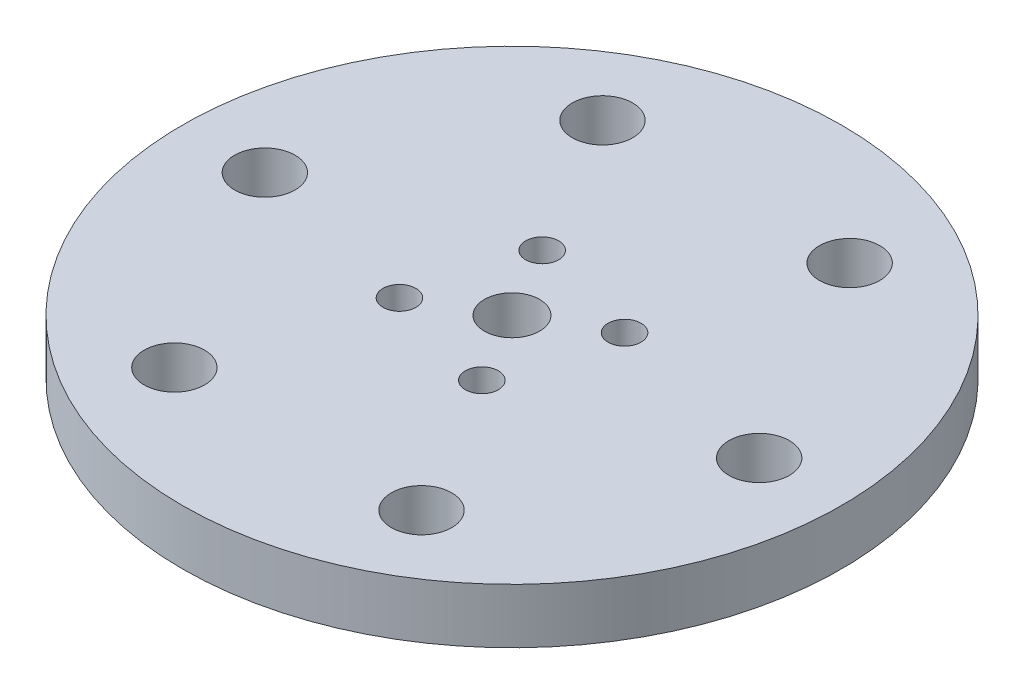
ISO-10303-21;
HEADER;
FILE_DESCRIPTION(('STEP AP214'),'2;1');
FILE_NAME('part.step','',(''),(''),'','','');
FILE_SCHEMA(('AUTOMOTIVE_DESIGN { 1 0 10303 214 1 1 1 1 }'));
ENDSEC;
DATA;
#1=APPLICATION_CONTEXT('core data for automotive mechanical design processes');
#2=APPLICATION_PROTOCOL_DEFINITION('international standard','automotive_design',2000,#1);
#3=PRODUCT_CONTEXT('',#1,'mechanical');
#4=PRODUCT('Part','Part','',(#3));
#5=PRODUCT_RELATED_PRODUCT_CATEGORY('part','',(#4));
#6=PRODUCT_DEFINITION_FORMATION('','',#4);
#7=PRODUCT_DEFINITION_CONTEXT('part definition',#1,'design');
#8=PRODUCT_DEFINITION('design','',#6,#7);
#9=PRODUCT_DEFINITION_SHAPE('','',#8);
#10=(LENGTH_UNIT() NAMED_UNIT(*) SI_UNIT(.MILLI.,.METRE.));
#11=(NAMED_UNIT(*) PLANE_ANGLE_UNIT() SI_UNIT($,.RADIAN.));
#12=(NAMED_UNIT(*) SI_UNIT($,.STERADIAN.) SOLID_ANGLE_UNIT());
#13=UNCERTAINTY_MEASURE_WITH_UNIT(LENGTH_MEASURE(1.E-05),#10,'distance_accuracy_value','');
#14=(GEOMETRIC_REPRESENTATION_CONTEXT(3) GLOBAL_UNCERTAINTY_ASSIGNED_CONTEXT((#13)) GLOBAL_UNIT_ASSIGNED_CONTEXT((#10,
#11,#12)) REPRESENTATION_CONTEXT('',''));
#15=CARTESIAN_POINT('',(0.,0.,0.));
#16=DIRECTION('',(0.,0.,1.));
#17=DIRECTION('',(1.,0.,0.));
#18=AXIS2_PLACEMENT_3D('',#15,#16,#17);
#19=CARTESIAN_POINT('',(65.7371127012522,5.6843418860808E-11,-53.6122531401902));
#20=DIRECTION('',(0.,-1.,0.));
#21=DIRECTION('',(0.,0.,-1.));
#22=AXIS2_PLACEMENT_3D('',#19,#20,#21);
#23=CONICAL_SURFACE('',#22,3.14999999997376,0.785398163397448);
#24=CARTESIAN_POINT('',(65.7371127012522,1.65,-53.6122531401902));
#25=DIRECTION('',(0.,-1.,0.));
#26=DIRECTION('',(0.,0.,-1.));
#27=AXIS2_PLACEMENT_3D('',#24,#25,#26);
#28=CIRCLE('',#27,1.5);
#29=CARTESIAN_POINT('',(65.7371127012522,1.65,-55.1122531401902));
#30=VERTEX_POINT('',#29);
#31=EDGE_CURVE('E30',#30,#30,#28,.F.);
#32=ORIENTED_EDGE('',*,*,#31,.T.);
#33=EDGE_LOOP('',(#32));
#34=FACE_BOUND('',#33,.T.);
#35=CARTESIAN_POINT('',(65.7371127012522,5.6843418860808E-11,-53.6122531401902));
#36=DIRECTION('',(0.,-1.,0.));
#37=DIRECTION('',(0.,0.,-1.));
#38=AXIS2_PLACEMENT_3D('',#35,#36,#37);
#39=CIRCLE('',#38,3.14999999997376);
#40=CARTESIAN_POINT('',(65.7371127012522,5.6843418860808E-11,-56.7622531401639));
#41=VERTEX_POINT('',#40);
#42=EDGE_CURVE('E18',#41,#41,#39,.T.);
#43=ORIENTED_EDGE('',*,*,#42,.T.);
#44=EDGE_LOOP('',(#43));
#45=FACE_BOUND('',#44,.T.);
#46=ADVANCED_FACE('F15',(#34,#45),#23,.F.);
#47=CARTESIAN_POINT('',(62.9919221728689,0.,-43.3670626118068));
#48=DIRECTION('',(0.,-1.,0.));
#49=DIRECTION('',(0.,0.,-1.));
#50=AXIS2_PLACEMENT_3D('',#47,#48,#49);
#51=CONICAL_SURFACE('',#50,3.15000000007655,0.785398163397448);
#52=CARTESIAN_POINT('',(62.9919221728689,1.65,-43.3670626118068));
#53=DIRECTION('',(0.,-1.,0.));
#54=DIRECTION('',(0.,0.,-1.));
#55=AXIS2_PLACEMENT_3D('',#52,#53,#54);
#56=CIRCLE('',#55,1.5);
#57=CARTESIAN_POINT('',(62.9919221728689,1.65,-44.8670626118068));
#58=VERTEX_POINT('',#57);
#59=EDGE_CURVE('E173',#58,#58,#56,.F.);
#60=ORIENTED_EDGE('',*,*,#59,.T.);
#61=EDGE_LOOP('',(#60));
#62=FACE_BOUND('',#61,.T.);
#63=CARTESIAN_POINT('',(62.9919221728689,0.,-43.3670626118068));
#64=DIRECTION('',(0.,-1.,0.));
#65=DIRECTION('',(0.,0.,-1.));
#66=AXIS2_PLACEMENT_3D('',#63,#64,#65);
#67=CIRCLE('',#66,3.15000000007655);
#68=CARTESIAN_POINT('',(62.9919221728689,0.,-46.5170626118834));
#69=VERTEX_POINT('',#68);
#70=EDGE_CURVE('E92',#69,#69,#67,.T.);
#71=ORIENTED_EDGE('',*,*,#70,.T.);
#72=EDGE_LOOP('',(#71));
#73=FACE_BOUND('',#72,.T.);
#74=ADVANCED_FACE('F191',(#62,#73),#51,.F.);
#75=CARTESIAN_POINT('',(73.2371127012522,5.6843418860808E-11,-40.6218720834236));
#76=DIRECTION('',(0.,-1.,0.));
#77=DIRECTION('',(0.,0.,-1.));
#78=AXIS2_PLACEMENT_3D('',#75,#76,#77);
#79=CONICAL_SURFACE('',#78,3.1500000000019,0.785398163397448);
#80=CARTESIAN_POINT('',(73.2371127012522,1.65,-40.6218720834236));
#81=DIRECTION('',(0.,-1.,0.));
#82=DIRECTION('',(0.,0.,-1.));
#83=AXIS2_PLACEMENT_3D('',#80,#81,#82);
#84=CIRCLE('',#83,1.5);
#85=CARTESIAN_POINT('',(73.2371127012522,1.65,-42.1218720834236));
#86=VERTEX_POINT('',#85);
#87=EDGE_CURVE('E175',#86,#86,#84,.F.);
#88=ORIENTED_EDGE('',*,*,#87,.T.);
#89=EDGE_LOOP('',(#88));
#90=FACE_BOUND('',#89,.T.);
#91=CARTESIAN_POINT('',(73.2371127012522,5.6843418860808E-11,-40.6218720834236));
#92=DIRECTION('',(0.,-1.,0.));
#93=DIRECTION('',(0.,0.,-1.));
#94=AXIS2_PLACEMENT_3D('',#91,#92,#93);
#95=CIRCLE('',#94,3.1500000000019);
#96=CARTESIAN_POINT('',(73.2371127012522,5.6843418860808E-11,-43.7718720834255));
#97=VERTEX_POINT('',#96);
#98=EDGE_CURVE('E90',#97,#97,#95,.T.);
#99=ORIENTED_EDGE('',*,*,#98,.T.);
#100=EDGE_LOOP('',(#99));
#101=FACE_BOUND('',#100,.T.);
#102=ADVANCED_FACE('F114',(#90,#101),#79,.F.);
#103=CARTESIAN_POINT('',(75.9823032296355,-5.6843418860808E-11,-50.8670626118069));
#104=DIRECTION('',(0.,-1.,0.));
#105=DIRECTION('',(0.,0.,-1.));
#106=AXIS2_PLACEMENT_3D('',#103,#104,#105);
#107=CONICAL_SURFACE('',#106,3.1500000001265,0.785398163397448);
#108=CARTESIAN_POINT('',(75.9823032296355,1.65,-50.8670626118069));
#109=DIRECTION('',(0.,-1.,0.));
#110=DIRECTION('',(0.,0.,-1.));
#111=AXIS2_PLACEMENT_3D('',#108,#109,#110);
#112=CIRCLE('',#111,1.5);
#113=CARTESIAN_POINT('',(75.9823032296355,1.65,-52.3670626118069));
#114=VERTEX_POINT('',#113);
#115=EDGE_CURVE('E86',#114,#114,#112,.F.);
#116=ORIENTED_EDGE('',*,*,#115,.T.);
#117=EDGE_LOOP('',(#116));
#118=FACE_BOUND('',#117,.T.);
#119=CARTESIAN_POINT('',(75.9823032296355,0.,-50.8670626118069));
#120=DIRECTION('',(0.,-1.,0.));
#121=DIRECTION('',(0.,0.,-1.));
#122=AXIS2_PLACEMENT_3D('',#119,#120,#121);
#123=CIRCLE('',#122,3.15000000006965);
#124=CARTESIAN_POINT('',(75.9823032296355,0.,-54.0170626118766));
#125=VERTEX_POINT('',#124);
#126=EDGE_CURVE('E87',#125,#125,#123,.T.);
#127=ORIENTED_EDGE('',*,*,#126,.T.);
#128=EDGE_LOOP('',(#127));
#129=FACE_BOUND('',#128,.T.);
#130=ADVANCED_FACE('F103',(#118,#129),#107,.F.);
#131=CARTESIAN_POINT('',(69.4871127012522,0.,-47.1170626118069));
#132=DIRECTION('',(0.,1.,0.));
#133=DIRECTION('',(0.,0.,1.));
#134=AXIS2_PLACEMENT_3D('',#131,#132,#133);
#135=PLANE('',#134);
#136=CARTESIAN_POINT('',(58.237112701252,0.,-27.6314910266571));
#137=DIRECTION('',(0.,-1.,0.));
#138=DIRECTION('',(0.,0.,-1.));
#139=AXIS2_PLACEMENT_3D('',#136,#137,#138);
#140=CIRCLE('',#139,2.75);
#141=CARTESIAN_POINT('',(58.237112701252,0.,-30.3814910266571));
#142=VERTEX_POINT('',#141);
#143=EDGE_CURVE('E65',#142,#142,#140,.F.);
#144=ORIENTED_EDGE('',*,*,#143,.T.);
#145=EDGE_LOOP('',(#144));
#146=FACE_BOUND('',#145,.T.);
#147=CARTESIAN_POINT('',(80.7371127012521,0.,-27.6314910266569));
#148=DIRECTION('',(0.,-1.,0.));
#149=DIRECTION('',(0.,0.,-1.));
#150=AXIS2_PLACEMENT_3D('',#147,#148,#149);
#151=CIRCLE('',#150,2.75);
#152=CARTESIAN_POINT('',(80.7371127012521,0.,-30.3814910266569));
#153=VERTEX_POINT('',#152);
#154=EDGE_CURVE('E83',#153,#153,#151,.F.);
#155=ORIENTED_EDGE('',*,*,#154,.T.);
#156=EDGE_LOOP('',(#155));
#157=FACE_BOUND('',#156,.T.);
#158=CARTESIAN_POINT('',(91.9871127012522,0.,-47.1170626118069));
#159=DIRECTION('',(0.,-1.,0.));
#160=DIRECTION('',(0.,0.,-1.));
#161=AXIS2_PLACEMENT_3D('',#158,#159,#160);
#162=CIRCLE('',#161,2.74999999999999);
#163=CARTESIAN_POINT('',(91.9871127012522,0.,-49.8670626118069));
#164=VERTEX_POINT('',#163);
#165=EDGE_CURVE('E68',#164,#164,#162,.F.);
#166=ORIENTED_EDGE('',*,*,#165,.T.);
#167=EDGE_LOOP('',(#166));
#168=FACE_BOUND('',#167,.T.);
#169=CARTESIAN_POINT('',(80.7371127012523,0.,-66.6026341969567));
#170=DIRECTION('',(0.,-1.,0.));
#171=DIRECTION('',(0.,0.,-1.));
#172=AXIS2_PLACEMENT_3D('',#169,#170,#171);
#173=CIRCLE('',#172,2.75);
#174=CARTESIAN_POINT('',(80.7371127012523,0.,-69.3526341969567));
#175=VERTEX_POINT('',#174);
#176=EDGE_CURVE('E80',#175,#175,#173,.F.);
#177=ORIENTED_EDGE('',*,*,#176,.T.);
#178=EDGE_LOOP('',(#177));
#179=FACE_BOUND('',#178,.T.);
#180=CARTESIAN_POINT('',(58.2371127012523,0.,-66.6026341969568));
#181=DIRECTION('',(0.,-1.,0.));
#182=DIRECTION('',(0.,0.,-1.));
#183=AXIS2_PLACEMENT_3D('',#180,#181,#182);
#184=CIRCLE('',#183,2.74999999999999);
#185=CARTESIAN_POINT('',(58.2371127012523,0.,-69.3526341969568));
#186=VERTEX_POINT('',#185);
#187=EDGE_CURVE('E71',#186,#186,#184,.F.);
#188=ORIENTED_EDGE('',*,*,#187,.T.);
#189=EDGE_LOOP('',(#188));
#190=FACE_BOUND('',#189,.T.);
#191=CARTESIAN_POINT('',(46.9871127012522,0.,-47.1170626118069));
#192=DIRECTION('',(0.,-1.,0.));
#193=DIRECTION('',(0.,0.,-1.));
#194=AXIS2_PLACEMENT_3D('',#191,#192,#193);
#195=CIRCLE('',#194,2.75);
#196=CARTESIAN_POINT('',(46.9871127012522,0.,-49.8670626118069));
#197=VERTEX_POINT('',#196);
#198=EDGE_CURVE('E77',#197,#197,#195,.F.);
#199=ORIENTED_EDGE('',*,*,#198,.T.);
#200=EDGE_LOOP('',(#199));
#201=FACE_BOUND('',#200,.T.);
#202=CARTESIAN_POINT('',(69.4871127012522,0.,-47.1170626118069));
#203=DIRECTION('',(0.,-1.,0.));
#204=DIRECTION('',(0.,0.,-1.));
#205=AXIS2_PLACEMENT_3D('',#202,#203,#204);
#206=CIRCLE('',#205,30.);
#207=CARTESIAN_POINT('',(69.4871127012522,0.,-77.1170626118069));
#208=VERTEX_POINT('',#207);
#209=EDGE_CURVE('E74',#208,#208,#206,.F.);
#210=ORIENTED_EDGE('',*,*,#209,.F.);
#211=EDGE_LOOP('',(#210));
#212=FACE_BOUND('',#211,.T.);
#213=CARTESIAN_POINT('',(69.4871127012522,0.,-47.1170626118069));
#214=DIRECTION('',(0.,-1.,0.));
#215=DIRECTION('',(0.,0.,-1.));
#216=AXIS2_PLACEMENT_3D('',#213,#214,#215);
#217=CIRCLE('',#216,2.50999999999999);
#218=CARTESIAN_POINT('',(69.4871127012522,0.,-49.6270626118069));
#219=VERTEX_POINT('',#218);
#220=EDGE_CURVE('E62',#219,#219,#217,.F.);
#221=ORIENTED_EDGE('',*,*,#220,.T.);
#222=EDGE_LOOP('',(#221));
#223=FACE_BOUND('',#222,.T.);
#224=ORIENTED_EDGE('',*,*,#126,.F.);
#225=EDGE_LOOP('',(#224));
#226=FACE_BOUND('',#225,.T.);
#227=ORIENTED_EDGE('',*,*,#98,.F.);
#228=EDGE_LOOP('',(#227));
#229=FACE_BOUND('',#228,.T.);
#230=ORIENTED_EDGE('',*,*,#70,.F.);
#231=EDGE_LOOP('',(#230));
#232=FACE_BOUND('',#231,.T.);
#233=ORIENTED_EDGE('',*,*,#42,.F.);
#234=EDGE_LOOP('',(#233));
#235=FACE_BOUND('',#234,.T.);
#236=ADVANCED_FACE('F100',(#146,#157,#168,#179,#190,#201,#212,#223,#226,#229,#232,#235),#135,.F.);
#237=CARTESIAN_POINT('',(65.7371127012522,0.,-53.6122531401902));
#238=DIRECTION('',(0.,-1.,0.));
#239=DIRECTION('',(0.,0.,-1.));
#240=AXIS2_PLACEMENT_3D('',#237,#238,#239);
#241=CYLINDRICAL_SURFACE('',#240,1.5);
#242=CARTESIAN_POINT('',(65.7371127012522,5.,-53.6122531401902));
#243=DIRECTION('',(0.,-1.,0.));
#244=DIRECTION('',(0.,0.,-1.));
#245=AXIS2_PLACEMENT_3D('',#242,#243,#244);
#246=CIRCLE('',#245,1.5);
#247=CARTESIAN_POINT('',(65.7371127012522,5.,-55.1122531401902));
#248=VERTEX_POINT('',#247);
#249=EDGE_CURVE('E59',#248,#248,#246,.T.);
#250=ORIENTED_EDGE('',*,*,#249,.F.);
#251=EDGE_LOOP('',(#250));
#252=FACE_BOUND('',#251,.T.);
#253=ORIENTED_EDGE('',*,*,#31,.F.);
#254=EDGE_LOOP('',(#253));
#255=FACE_BOUND('',#254,.T.);
#256=ADVANCED_FACE('F102',(#252,#255),#241,.F.);
#257=CARTESIAN_POINT('',(62.9919221728689,0.,-43.3670626118068));
#258=DIRECTION('',(0.,-1.,0.));
#259=DIRECTION('',(0.,0.,-1.));
#260=AXIS2_PLACEMENT_3D('',#257,#258,#259);
#261=CYLINDRICAL_SURFACE('',#260,1.5);
#262=CARTESIAN_POINT('',(62.9919221728689,5.,-43.3670626118068));
#263=DIRECTION('',(0.,-1.,0.));
#264=DIRECTION('',(0.,0.,-1.));
#265=AXIS2_PLACEMENT_3D('',#262,#263,#264);
#266=CIRCLE('',#265,1.5);
#267=CARTESIAN_POINT('',(62.9919221728689,5.,-44.8670626118068));
#268=VERTEX_POINT('',#267);
#269=EDGE_CURVE('E56',#268,#268,#266,.T.);
#270=ORIENTED_EDGE('',*,*,#269,.F.);
#271=EDGE_LOOP('',(#270));
#272=FACE_BOUND('',#271,.T.);
#273=ORIENTED_EDGE('',*,*,#59,.F.);
#274=EDGE_LOOP('',(#273));
#275=FACE_BOUND('',#274,.T.);
#276=ADVANCED_FACE('F111',(#272,#275),#261,.F.);
#277=CARTESIAN_POINT('',(73.2371127012522,0.,-40.6218720834236));
#278=DIRECTION('',(0.,-1.,0.));
#279=DIRECTION('',(0.,0.,-1.));
#280=AXIS2_PLACEMENT_3D('',#277,#278,#279);
#281=CYLINDRICAL_SURFACE('',#280,1.5);
#282=CARTESIAN_POINT('',(73.2371127012522,5.,-40.6218720834236));
#283=DIRECTION('',(0.,-1.,0.));
#284=DIRECTION('',(0.,0.,-1.));
#285=AXIS2_PLACEMENT_3D('',#282,#283,#284);
#286=CIRCLE('',#285,1.5);
#287=CARTESIAN_POINT('',(73.2371127012522,5.,-42.1218720834236));
#288=VERTEX_POINT('',#287);
#289=EDGE_CURVE('E53',#288,#288,#286,.T.);
#290=ORIENTED_EDGE('',*,*,#289,.F.);
#291=EDGE_LOOP('',(#290));
#292=FACE_BOUND('',#291,.T.);
#293=ORIENTED_EDGE('',*,*,#87,.F.);
#294=EDGE_LOOP('',(#293));
#295=FACE_BOUND('',#294,.T.);
#296=ADVANCED_FACE('F160',(#292,#295),#281,.F.);
#297=CARTESIAN_POINT('',(75.9823032296355,0.,-50.8670626118069));
#298=DIRECTION('',(0.,-1.,0.));
#299=DIRECTION('',(0.,0.,-1.));
#300=AXIS2_PLACEMENT_3D('',#297,#298,#299);
#301=CYLINDRICAL_SURFACE('',#300,1.5);
#302=CARTESIAN_POINT('',(75.9823032296355,5.,-50.8670626118069));
#303=DIRECTION('',(0.,-1.,0.));
#304=DIRECTION('',(0.,0.,-1.));
#305=AXIS2_PLACEMENT_3D('',#302,#303,#304);
#306=CIRCLE('',#305,1.5);
#307=CARTESIAN_POINT('',(75.9823032296355,5.,-52.3670626118069));
#308=VERTEX_POINT('',#307);
#309=EDGE_CURVE('E50',#308,#308,#306,.T.);
#310=ORIENTED_EDGE('',*,*,#309,.F.);
#311=EDGE_LOOP('',(#310));
#312=FACE_BOUND('',#311,.T.);
#313=ORIENTED_EDGE('',*,*,#115,.F.);
#314=EDGE_LOOP('',(#313));
#315=FACE_BOUND('',#314,.T.);
#316=ADVANCED_FACE('F156',(#312,#315),#301,.F.);
#317=CARTESIAN_POINT('',(80.7371127012521,5.,-27.6314910266569));
#318=DIRECTION('',(0.,-1.,0.));
#319=DIRECTION('',(0.,0.,-1.));
#320=AXIS2_PLACEMENT_3D('',#317,#318,#319);
#321=CYLINDRICAL_SURFACE('',#320,2.75);
#322=CARTESIAN_POINT('',(80.7371127012521,5.,-27.6314910266569));
#323=DIRECTION('',(0.,-1.,0.));
#324=DIRECTION('',(0.,0.,-1.));
#325=AXIS2_PLACEMENT_3D('',#322,#323,#324);
#326=CIRCLE('',#325,2.75);
#327=CARTESIAN_POINT('',(80.7371127012521,5.,-30.3814910266569));
#328=VERTEX_POINT('',#327);
#329=EDGE_CURVE('E47',#328,#328,#326,.T.);
#330=ORIENTED_EDGE('',*,*,#329,.F.);
#331=EDGE_LOOP('',(#330));
#332=FACE_BOUND('',#331,.T.);
#333=ORIENTED_EDGE('',*,*,#154,.F.);
#334=EDGE_LOOP('',(#333));
#335=FACE_BOUND('',#334,.T.);
#336=ADVANCED_FACE('F152',(#332,#335),#321,.F.);
#337=CARTESIAN_POINT('',(80.7371127012523,5.,-66.6026341969567));
#338=DIRECTION('',(0.,-1.,0.));
#339=DIRECTION('',(0.,0.,-1.));
#340=AXIS2_PLACEMENT_3D('',#337,#338,#339);
#341=CYLINDRICAL_SURFACE('',#340,2.75);
#342=CARTESIAN_POINT('',(80.7371127012523,5.,-66.6026341969567));
#343=DIRECTION('',(0.,-1.,0.));
#344=DIRECTION('',(0.,0.,-1.));
#345=AXIS2_PLACEMENT_3D('',#342,#343,#344);
#346=CIRCLE('',#345,2.75);
#347=CARTESIAN_POINT('',(80.7371127012523,5.,-69.3526341969567));
#348=VERTEX_POINT('',#347);
#349=EDGE_CURVE('E44',#348,#348,#346,.T.);
#350=ORIENTED_EDGE('',*,*,#349,.F.);
#351=EDGE_LOOP('',(#350));
#352=FACE_BOUND('',#351,.T.);
#353=ORIENTED_EDGE('',*,*,#176,.F.);
#354=EDGE_LOOP('',(#353));
#355=FACE_BOUND('',#354,.T.);
#356=ADVANCED_FACE('F148',(#352,#355),#341,.F.);
#357=CARTESIAN_POINT('',(46.9871127012522,5.,-47.1170626118069));
#358=DIRECTION('',(0.,-1.,0.));
#359=DIRECTION('',(0.,0.,-1.));
#360=AXIS2_PLACEMENT_3D('',#357,#358,#359);
#361=CYLINDRICAL_SURFACE('',#360,2.75);
#362=CARTESIAN_POINT('',(46.9871127012522,5.,-47.1170626118069));
#363=DIRECTION('',(0.,-1.,0.));
#364=DIRECTION('',(0.,0.,-1.));
#365=AXIS2_PLACEMENT_3D('',#362,#363,#364);
#366=CIRCLE('',#365,2.75);
#367=CARTESIAN_POINT('',(46.9871127012522,5.,-49.8670626118069));
#368=VERTEX_POINT('',#367);
#369=EDGE_CURVE('E41',#368,#368,#366,.T.);
#370=ORIENTED_EDGE('',*,*,#369,.F.);
#371=EDGE_LOOP('',(#370));
#372=FACE_BOUND('',#371,.T.);
#373=ORIENTED_EDGE('',*,*,#198,.F.);
#374=EDGE_LOOP('',(#373));
#375=FACE_BOUND('',#374,.T.);
#376=ADVANCED_FACE('F144',(#372,#375),#361,.F.);
#377=CARTESIAN_POINT('',(69.4871127012522,5.,-47.1170626118069));
#378=DIRECTION('',(0.,-1.,0.));
#379=DIRECTION('',(0.,0.,-1.));
#380=AXIS2_PLACEMENT_3D('',#377,#378,#379);
#381=CYLINDRICAL_SURFACE('',#380,30.);
#382=ORIENTED_EDGE('',*,*,#209,.T.);
#383=EDGE_LOOP('',(#382));
#384=FACE_BOUND('',#383,.T.);
#385=CARTESIAN_POINT('',(69.4871127012522,5.,-47.1170626118069));
#386=DIRECTION('',(0.,-1.,0.));
#387=DIRECTION('',(0.,0.,-1.));
#388=AXIS2_PLACEMENT_3D('',#385,#386,#387);
#389=CIRCLE('',#388,30.);
#390=CARTESIAN_POINT('',(69.4871127012522,5.,-77.1170626118069));
#391=VERTEX_POINT('',#390);
#392=EDGE_CURVE('E38',#391,#391,#389,.F.);
#393=ORIENTED_EDGE('',*,*,#392,.F.);
#394=EDGE_LOOP('',(#393));
#395=FACE_BOUND('',#394,.T.);
#396=ADVANCED_FACE('F140',(#384,#395),#381,.T.);
#397=CARTESIAN_POINT('',(58.2371127012523,5.,-66.6026341969568));
#398=DIRECTION('',(0.,-1.,0.));
#399=DIRECTION('',(0.,0.,-1.));
#400=AXIS2_PLACEMENT_3D('',#397,#398,#399);
#401=CYLINDRICAL_SURFACE('',#400,2.74999999999999);
#402=CARTESIAN_POINT('',(58.2371127012523,5.,-66.6026341969568));
#403=DIRECTION('',(0.,-1.,0.));
#404=DIRECTION('',(0.,0.,-1.));
#405=AXIS2_PLACEMENT_3D('',#402,#403,#404);
#406=CIRCLE('',#405,2.74999999999999);
#407=CARTESIAN_POINT('',(58.2371127012523,5.,-69.3526341969568));
#408=VERTEX_POINT('',#407);
#409=EDGE_CURVE('E35',#408,#408,#406,.T.);
#410=ORIENTED_EDGE('',*,*,#409,.F.);
#411=EDGE_LOOP('',(#410));
#412=FACE_BOUND('',#411,.T.);
#413=ORIENTED_EDGE('',*,*,#187,.F.);
#414=EDGE_LOOP('',(#413));
#415=FACE_BOUND('',#414,.T.);
#416=ADVANCED_FACE('F136',(#412,#415),#401,.F.);
#417=CARTESIAN_POINT('',(91.9871127012522,5.,-47.1170626118069));
#418=DIRECTION('',(0.,-1.,0.));
#419=DIRECTION('',(0.,0.,-1.));
#420=AXIS2_PLACEMENT_3D('',#417,#418,#419);
#421=CYLINDRICAL_SURFACE('',#420,2.74999999999999);
#422=CARTESIAN_POINT('',(91.9871127012522,5.,-47.1170626118069));
#423=DIRECTION('',(0.,-1.,0.));
#424=DIRECTION('',(0.,0.,-1.));
#425=AXIS2_PLACEMENT_3D('',#422,#423,#424);
#426=CIRCLE('',#425,2.74999999999999);
#427=CARTESIAN_POINT('',(91.9871127012522,5.,-49.8670626118069));
#428=VERTEX_POINT('',#427);
#429=EDGE_CURVE('E27',#428,#428,#426,.T.);
#430=ORIENTED_EDGE('',*,*,#429,.F.);
#431=EDGE_LOOP('',(#430));
#432=FACE_BOUND('',#431,.T.);
#433=ORIENTED_EDGE('',*,*,#165,.F.);
#434=EDGE_LOOP('',(#433));
#435=FACE_BOUND('',#434,.T.);
#436=ADVANCED_FACE('F132',(#432,#435),#421,.F.);
#437=CARTESIAN_POINT('',(58.237112701252,5.,-27.6314910266571));
#438=DIRECTION('',(0.,-1.,0.));
#439=DIRECTION('',(0.,0.,-1.));
#440=AXIS2_PLACEMENT_3D('',#437,#438,#439);
#441=CYLINDRICAL_SURFACE('',#440,2.75);
#442=CARTESIAN_POINT('',(58.237112701252,5.,-27.6314910266571));
#443=DIRECTION('',(0.,-1.,0.));
#444=DIRECTION('',(0.,0.,-1.));
#445=AXIS2_PLACEMENT_3D('',#442,#443,#444);
#446=CIRCLE('',#445,2.75);
#447=CARTESIAN_POINT('',(58.237112701252,5.,-30.3814910266571));
#448=VERTEX_POINT('',#447);
#449=EDGE_CURVE('E22',#448,#448,#446,.T.);
#450=ORIENTED_EDGE('',*,*,#449,.F.);
#451=EDGE_LOOP('',(#450));
#452=FACE_BOUND('',#451,.T.);
#453=ORIENTED_EDGE('',*,*,#143,.F.);
#454=EDGE_LOOP('',(#453));
#455=FACE_BOUND('',#454,.T.);
#456=ADVANCED_FACE('F125',(#452,#455),#441,.F.);
#457=CARTESIAN_POINT('',(69.4871127012522,22.,-47.1170626118069));
#458=DIRECTION('',(0.,-1.,0.));
#459=DIRECTION('',(0.,0.,-1.));
#460=AXIS2_PLACEMENT_3D('',#457,#458,#459);
#461=CYLINDRICAL_SURFACE('',#460,2.50999999999999);
#462=ORIENTED_EDGE('',*,*,#220,.F.);
#463=EDGE_LOOP('',(#462));
#464=FACE_BOUND('',#463,.T.);
#465=CARTESIAN_POINT('',(69.4871127012522,4.99999999999999,-47.1170626118069));
#466=DIRECTION('',(0.,-1.,0.));
#467=DIRECTION('',(0.,0.,-1.));
#468=AXIS2_PLACEMENT_3D('',#465,#466,#467);
#469=CIRCLE('',#468,2.50999999999999);
#470=CARTESIAN_POINT('',(69.4871127012522,4.99999999999999,-49.6270626118069));
#471=VERTEX_POINT('',#470);
#472=EDGE_CURVE('E10',#471,#471,#469,.T.);
#473=ORIENTED_EDGE('',*,*,#472,.F.);
#474=EDGE_LOOP('',(#473));
#475=FACE_BOUND('',#474,.T.);
#476=ADVANCED_FACE('F120',(#464,#475),#461,.F.);
#477=CARTESIAN_POINT('',(69.4871127012522,5.,-47.1170626118069));
#478=DIRECTION('',(0.,1.,0.));
#479=DIRECTION('',(0.,0.,1.));
#480=AXIS2_PLACEMENT_3D('',#477,#478,#479);
#481=PLANE('',#480);
#482=ORIENTED_EDGE('',*,*,#472,.T.);
#483=EDGE_LOOP('',(#482));
#484=FACE_BOUND('',#483,.T.);
#485=ORIENTED_EDGE('',*,*,#449,.T.);
#486=EDGE_LOOP('',(#485));
#487=FACE_BOUND('',#486,.T.);
#488=ORIENTED_EDGE('',*,*,#429,.T.);
#489=EDGE_LOOP('',(#488));
#490=FACE_BOUND('',#489,.T.);
#491=ORIENTED_EDGE('',*,*,#409,.T.);
#492=EDGE_LOOP('',(#491));
#493=FACE_BOUND('',#492,.T.);
#494=ORIENTED_EDGE('',*,*,#392,.T.);
#495=EDGE_LOOP('',(#494));
#496=FACE_BOUND('',#495,.T.);
#497=ORIENTED_EDGE('',*,*,#369,.T.);
#498=EDGE_LOOP('',(#497));
#499=FACE_BOUND('',#498,.T.);
#500=ORIENTED_EDGE('',*,*,#349,.T.);
#501=EDGE_LOOP('',(#500));
#502=FACE_BOUND('',#501,.T.);
#503=ORIENTED_EDGE('',*,*,#329,.T.);
#504=EDGE_LOOP('',(#503));
#505=FACE_BOUND('',#504,.T.);
#506=ORIENTED_EDGE('',*,*,#309,.T.);
#507=EDGE_LOOP('',(#506));
#508=FACE_BOUND('',#507,.T.);
#509=ORIENTED_EDGE('',*,*,#289,.T.);
#510=EDGE_LOOP('',(#509));
#511=FACE_BOUND('',#510,.T.);
#512=ORIENTED_EDGE('',*,*,#269,.T.);
#513=EDGE_LOOP('',(#512));
#514=FACE_BOUND('',#513,.T.);
#515=ORIENTED_EDGE('',*,*,#249,.T.);
#516=EDGE_LOOP('',(#515));
#517=FACE_BOUND('',#516,.T.);
#518=ADVANCED_FACE('F118',(#484,#487,#490,#493,#496,#499,#502,#505,#508,#511,#514,#517),#481,.T.);
#519=CLOSED_SHELL('',(#46,#74,#102,#130,#236,#256,#276,#296,#316,#336,#356,#376,#396,#416,#436,
#456,#476,#518));
#520=MANIFOLD_SOLID_BREP('B1',#519);
#521=ADVANCED_BREP_SHAPE_REPRESENTATION('',(#18,#520),#14);
#522=SHAPE_DEFINITION_REPRESENTATION(#9,#521);
ENDSEC;
END-ISO-10303-21;
